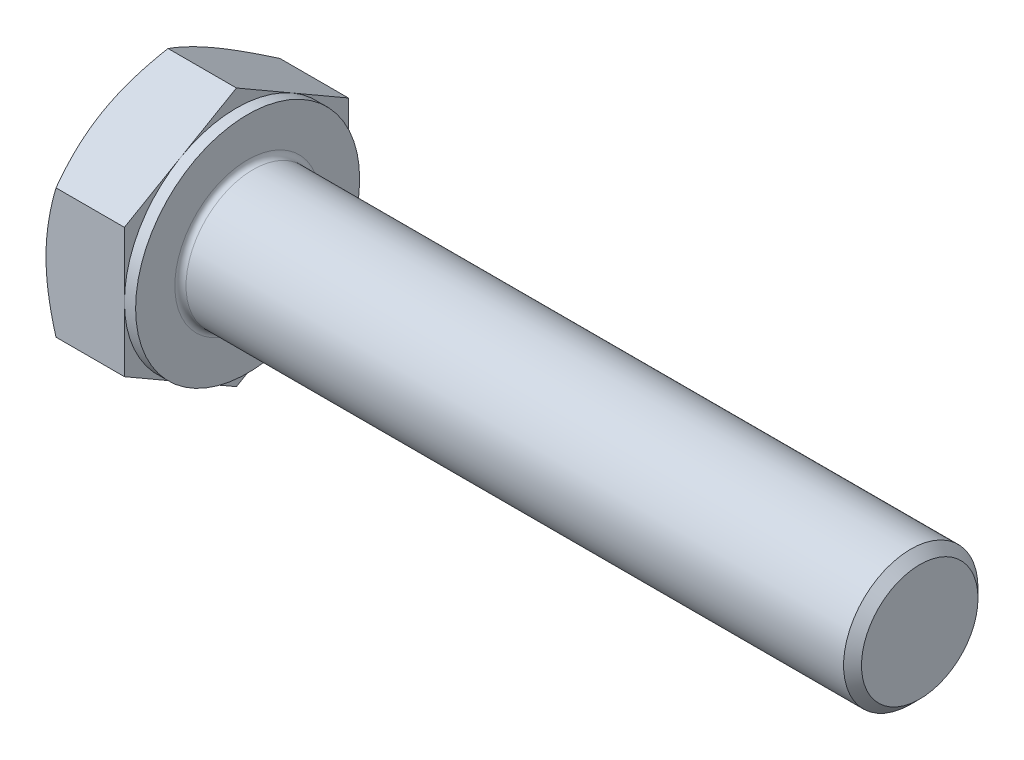
ISO-10303-21;
HEADER;
FILE_DESCRIPTION(('STEP AP214'),'2;1');
FILE_NAME('part.step','',(''),(''),'','','');
FILE_SCHEMA(('AUTOMOTIVE_DESIGN { 1 0 10303 214 1 1 1 1 }'));
ENDSEC;
DATA;
#1=APPLICATION_CONTEXT('core data for automotive mechanical design processes');
#2=APPLICATION_PROTOCOL_DEFINITION('international standard','automotive_design',2000,#1);
#3=PRODUCT_CONTEXT('',#1,'mechanical');
#4=PRODUCT('Part','Part','',(#3));
#5=PRODUCT_RELATED_PRODUCT_CATEGORY('part','',(#4));
#6=PRODUCT_DEFINITION_FORMATION('','',#4);
#7=PRODUCT_DEFINITION_CONTEXT('part definition',#1,'design');
#8=PRODUCT_DEFINITION('design','',#6,#7);
#9=PRODUCT_DEFINITION_SHAPE('','',#8);
#10=(LENGTH_UNIT() NAMED_UNIT(*) SI_UNIT(.MILLI.,.METRE.));
#11=(NAMED_UNIT(*) PLANE_ANGLE_UNIT() SI_UNIT($,.RADIAN.));
#12=(NAMED_UNIT(*) SI_UNIT($,.STERADIAN.) SOLID_ANGLE_UNIT());
#13=UNCERTAINTY_MEASURE_WITH_UNIT(LENGTH_MEASURE(1.E-05),#10,'distance_accuracy_value','');
#14=(GEOMETRIC_REPRESENTATION_CONTEXT(3) GLOBAL_UNCERTAINTY_ASSIGNED_CONTEXT((#13)) GLOBAL_UNIT_ASSIGNED_CONTEXT((#10,
#11,#12)) REPRESENTATION_CONTEXT('',''));
#15=CARTESIAN_POINT('',(0.,0.,0.));
#16=DIRECTION('',(0.,0.,1.));
#17=DIRECTION('',(1.,0.,0.));
#18=AXIS2_PLACEMENT_3D('',#15,#16,#17);
#19=CARTESIAN_POINT('',(0.,0.,0.));
#20=DIRECTION('',(-1.,0.,0.));
#21=DIRECTION('',(0.,0.,1.));
#22=AXIS2_PLACEMENT_3D('',#19,#20,#21);
#23=CYLINDRICAL_SURFACE('',#22,3.);
#24=CARTESIAN_POINT('',(33.6,0.,0.));
#25=DIRECTION('',(1.,0.,0.));
#26=DIRECTION('',(0.,0.,-1.));
#27=AXIS2_PLACEMENT_3D('',#24,#25,#26);
#28=CIRCLE('',#27,3.);
#29=CARTESIAN_POINT('',(33.6,0.,-3.));
#30=VERTEX_POINT('',#29);
#31=EDGE_CURVE('E13',#30,#30,#28,.F.);
#32=ORIENTED_EDGE('',*,*,#31,.T.);
#33=EDGE_LOOP('',(#32));
#34=FACE_BOUND('',#33,.T.);
#35=CARTESIAN_POINT('',(4.25,0.,0.));
#36=DIRECTION('',(1.,0.,0.));
#37=DIRECTION('',(0.,0.,-1.));
#38=AXIS2_PLACEMENT_3D('',#35,#36,#37);
#39=CIRCLE('',#38,3.);
#40=CARTESIAN_POINT('',(4.25,0.,-3.));
#41=VERTEX_POINT('',#40);
#42=EDGE_CURVE('E279',#41,#41,#39,.T.);
#43=ORIENTED_EDGE('',*,*,#42,.T.);
#44=EDGE_LOOP('',(#43));
#45=FACE_BOUND('',#44,.T.);
#46=ADVANCED_FACE('F42',(#34,#45),#23,.T.);
#47=CARTESIAN_POINT('',(4.,5.77350269189626,0.));
#48=DIRECTION('',(1.,0.,0.));
#49=DIRECTION('',(0.,0.,-1.));
#50=AXIS2_PLACEMENT_3D('',#47,#48,#49);
#51=PLANE('',#50);
#52=CARTESIAN_POINT('',(4.,0.,0.));
#53=DIRECTION('',(1.,0.,0.));
#54=DIRECTION('',(0.,0.,-1.));
#55=AXIS2_PLACEMENT_3D('',#52,#53,#54);
#56=CIRCLE('',#55,3.25);
#57=CARTESIAN_POINT('',(4.,0.,-3.25));
#58=VERTEX_POINT('',#57);
#59=EDGE_CURVE('E280',#58,#58,#56,.F.);
#60=ORIENTED_EDGE('',*,*,#59,.T.);
#61=EDGE_LOOP('',(#60));
#62=FACE_BOUND('',#61,.T.);
#63=CARTESIAN_POINT('',(4.,0.,0.));
#64=DIRECTION('',(1.,0.,0.));
#65=DIRECTION('',(0.,0.,-1.));
#66=AXIS2_PLACEMENT_3D('',#63,#64,#65);
#67=CIRCLE('',#66,5.);
#68=CARTESIAN_POINT('',(4.,0.,-5.));
#69=VERTEX_POINT('',#68);
#70=EDGE_CURVE('E289',#69,#69,#67,.T.);
#71=ORIENTED_EDGE('',*,*,#70,.T.);
#72=EDGE_LOOP('',(#71));
#73=FACE_BOUND('',#72,.T.);
#74=ADVANCED_FACE('F269',(#62,#73),#51,.T.);
#75=CARTESIAN_POINT('',(3.5,5.,0.));
#76=DIRECTION('',(1.,0.,0.));
#77=DIRECTION('',(0.,0.,-1.));
#78=AXIS2_PLACEMENT_3D('',#75,#76,#77);
#79=PLANE('',#78);
#80=DIRECTION('',(0.,0.5,0.866025403784438));
#81=VECTOR('',#80,1.);
#82=CARTESIAN_POINT('',(3.5,2.88675134594812,-5.));
#83=LINE('',#82,#81);
#84=CARTESIAN_POINT('',(3.5,2.88675134594812,-5.));
#85=VERTEX_POINT('',#84);
#86=CARTESIAN_POINT('',(3.5,4.33012701892219,-2.5));
#87=VERTEX_POINT('',#86);
#88=EDGE_CURVE('E175',#85,#87,#83,.T.);
#89=ORIENTED_EDGE('',*,*,#88,.T.);
#90=CARTESIAN_POINT('',(3.5,0.,0.));
#91=DIRECTION('',(-1.,0.,0.));
#92=DIRECTION('',(0.,0.,1.));
#93=AXIS2_PLACEMENT_3D('',#90,#91,#92);
#94=CIRCLE('',#93,5.);
#95=CARTESIAN_POINT('',(3.5,0.,-5.));
#96=VERTEX_POINT('',#95);
#97=EDGE_CURVE('E58',#87,#96,#94,.T.);
#98=ORIENTED_EDGE('',*,*,#97,.T.);
#99=DIRECTION('',(0.,1.,0.));
#100=VECTOR('',#99,1.);
#101=CARTESIAN_POINT('',(3.5,2.88675134594812,-5.));
#102=LINE('',#101,#100);
#103=EDGE_CURVE('E287',#96,#85,#102,.T.);
#104=ORIENTED_EDGE('',*,*,#103,.T.);
#105=EDGE_LOOP('',(#89,#98,#104));
#106=FACE_BOUND('',#105,.T.);
#107=ADVANCED_FACE('F274',(#106),#79,.T.);
#108=CARTESIAN_POINT('',(3.5,5.77350269189626,0.));
#109=VERTEX_POINT('',#108);
#110=EDGE_CURVE('E173',#87,#109,#83,.T.);
#111=ORIENTED_EDGE('',*,*,#110,.T.);
#112=DIRECTION('',(0.,-0.5,0.866025403784438));
#113=VECTOR('',#112,1.);
#114=CARTESIAN_POINT('',(3.5,5.77350269189626,0.));
#115=LINE('',#114,#113);
#116=CARTESIAN_POINT('',(3.5,4.33012701892219,2.5));
#117=VERTEX_POINT('',#116);
#118=EDGE_CURVE('E172',#109,#117,#115,.T.);
#119=ORIENTED_EDGE('',*,*,#118,.T.);
#120=EDGE_CURVE('E161',#117,#87,#94,.T.);
#121=ORIENTED_EDGE('',*,*,#120,.T.);
#122=EDGE_LOOP('',(#111,#119,#121));
#123=FACE_BOUND('',#122,.T.);
#124=ADVANCED_FACE('F361',(#123),#79,.T.);
#125=CARTESIAN_POINT('',(3.5,2.88675134594812,5.));
#126=VERTEX_POINT('',#125);
#127=EDGE_CURVE('E140',#117,#126,#115,.T.);
#128=ORIENTED_EDGE('',*,*,#127,.T.);
#129=DIRECTION('',(0.,-1.,0.));
#130=VECTOR('',#129,1.);
#131=CARTESIAN_POINT('',(3.5,2.88675134594812,5.));
#132=LINE('',#131,#130);
#133=CARTESIAN_POINT('',(3.5,0.,5.));
#134=VERTEX_POINT('',#133);
#135=EDGE_CURVE('E134',#126,#134,#132,.T.);
#136=ORIENTED_EDGE('',*,*,#135,.T.);
#137=EDGE_CURVE('E138',#134,#117,#94,.T.);
#138=ORIENTED_EDGE('',*,*,#137,.T.);
#139=EDGE_LOOP('',(#128,#136,#138));
#140=FACE_BOUND('',#139,.T.);
#141=ADVANCED_FACE('F136',(#140),#79,.T.);
#142=CARTESIAN_POINT('',(3.5,-2.88675134594812,5.));
#143=VERTEX_POINT('',#142);
#144=EDGE_CURVE('E144',#134,#143,#132,.T.);
#145=ORIENTED_EDGE('',*,*,#144,.T.);
#146=DIRECTION('',(0.,-0.5,-0.866025403784438));
#147=VECTOR('',#146,1.);
#148=CARTESIAN_POINT('',(3.5,-5.77350269189626,0.));
#149=LINE('',#148,#147);
#150=CARTESIAN_POINT('',(3.5,-4.33012701892219,2.5));
#151=VERTEX_POINT('',#150);
#152=EDGE_CURVE('E151',#143,#151,#149,.T.);
#153=ORIENTED_EDGE('',*,*,#152,.T.);
#154=EDGE_CURVE('E148',#151,#134,#94,.T.);
#155=ORIENTED_EDGE('',*,*,#154,.T.);
#156=EDGE_LOOP('',(#145,#153,#155));
#157=FACE_BOUND('',#156,.T.);
#158=ADVANCED_FACE('F149',(#157),#79,.T.);
#159=CARTESIAN_POINT('',(3.5,-5.77350269189626,0.));
#160=VERTEX_POINT('',#159);
#161=EDGE_CURVE('E167',#151,#160,#149,.T.);
#162=ORIENTED_EDGE('',*,*,#161,.T.);
#163=DIRECTION('',(0.,0.5,-0.866025403784439));
#164=VECTOR('',#163,1.);
#165=CARTESIAN_POINT('',(3.5,-2.88675134594813,-5.));
#166=LINE('',#165,#164);
#167=CARTESIAN_POINT('',(3.5,-4.3301270189222,-2.5));
#168=VERTEX_POINT('',#167);
#169=EDGE_CURVE('E353',#160,#168,#166,.T.);
#170=ORIENTED_EDGE('',*,*,#169,.T.);
#171=EDGE_CURVE('E155',#168,#151,#94,.T.);
#172=ORIENTED_EDGE('',*,*,#171,.T.);
#173=EDGE_LOOP('',(#162,#170,#172));
#174=FACE_BOUND('',#173,.T.);
#175=ADVANCED_FACE('F375',(#174),#79,.T.);
#176=CARTESIAN_POINT('',(3.5,-2.88675134594813,-5.));
#177=VERTEX_POINT('',#176);
#178=EDGE_CURVE('E162',#168,#177,#166,.T.);
#179=ORIENTED_EDGE('',*,*,#178,.T.);
#180=EDGE_CURVE('E284',#177,#96,#102,.T.);
#181=ORIENTED_EDGE('',*,*,#180,.T.);
#182=EDGE_CURVE('E359',#96,#168,#94,.T.);
#183=ORIENTED_EDGE('',*,*,#182,.T.);
#184=EDGE_LOOP('',(#179,#181,#183));
#185=FACE_BOUND('',#184,.T.);
#186=ADVANCED_FACE('F357',(#185),#79,.T.);
#187=CARTESIAN_POINT('',(0.,0.,0.));
#188=DIRECTION('',(-1.,0.,0.));
#189=DIRECTION('',(0.,0.,1.));
#190=AXIS2_PLACEMENT_3D('',#187,#188,#189);
#191=CYLINDRICAL_SURFACE('',#190,5.);
#192=ORIENTED_EDGE('',*,*,#97,.F.);
#193=ORIENTED_EDGE('',*,*,#120,.F.);
#194=ORIENTED_EDGE('',*,*,#137,.F.);
#195=ORIENTED_EDGE('',*,*,#154,.F.);
#196=ORIENTED_EDGE('',*,*,#171,.F.);
#197=ORIENTED_EDGE('',*,*,#182,.F.);
#198=EDGE_LOOP('',(#192,#193,#194,#195,#196,#197));
#199=FACE_BOUND('',#198,.T.);
#200=ORIENTED_EDGE('',*,*,#70,.F.);
#201=EDGE_LOOP('',(#200));
#202=FACE_BOUND('',#201,.T.);
#203=ADVANCED_FACE('F158',(#199,#202),#191,.T.);
#204=CARTESIAN_POINT('',(0.,5.77350269189626,0.));
#205=DIRECTION('',(1.,0.,0.));
#206=DIRECTION('',(0.,0.,-1.));
#207=AXIS2_PLACEMENT_3D('',#204,#205,#206);
#208=PLANE('',#207);
#209=CARTESIAN_POINT('',(0.,0.,0.));
#210=DIRECTION('',(1.,0.,0.));
#211=DIRECTION('',(0.,0.,-1.));
#212=AXIS2_PLACEMENT_3D('',#209,#210,#211);
#213=CIRCLE('',#212,5.);
#214=CARTESIAN_POINT('',(0.,0.,-5.));
#215=VERTEX_POINT('',#214);
#216=CARTESIAN_POINT('',(0.,4.33012701892219,-2.5));
#217=VERTEX_POINT('',#216);
#218=EDGE_CURVE('E292',#215,#217,#213,.T.);
#219=ORIENTED_EDGE('',*,*,#218,.F.);
#220=CARTESIAN_POINT('',(0.,-4.3301270189222,-2.5));
#221=VERTEX_POINT('',#220);
#222=EDGE_CURVE('E293',#221,#215,#213,.T.);
#223=ORIENTED_EDGE('',*,*,#222,.F.);
#224=CARTESIAN_POINT('',(0.,-4.33012701892219,2.5));
#225=VERTEX_POINT('',#224);
#226=EDGE_CURVE('E296',#225,#221,#213,.T.);
#227=ORIENTED_EDGE('',*,*,#226,.F.);
#228=CARTESIAN_POINT('',(0.,0.,5.));
#229=VERTEX_POINT('',#228);
#230=EDGE_CURVE('E327',#229,#225,#213,.T.);
#231=ORIENTED_EDGE('',*,*,#230,.F.);
#232=CARTESIAN_POINT('',(0.,0.,0.));
#233=DIRECTION('',(-1.,0.,0.));
#234=DIRECTION('',(0.,0.,1.));
#235=AXIS2_PLACEMENT_3D('',#232,#233,#234);
#236=CIRCLE('',#235,5.);
#237=CARTESIAN_POINT('',(0.,4.33012701892219,2.5));
#238=VERTEX_POINT('',#237);
#239=EDGE_CURVE('E176',#229,#238,#236,.T.);
#240=ORIENTED_EDGE('',*,*,#239,.T.);
#241=EDGE_CURVE('E324',#217,#238,#213,.T.);
#242=ORIENTED_EDGE('',*,*,#241,.F.);
#243=EDGE_LOOP('',(#219,#223,#227,#231,#240,#242));
#244=FACE_BOUND('',#243,.T.);
#245=ADVANCED_FACE('F207',(#244),#208,.F.);
#246=CARTESIAN_POINT('',(0.,0.,0.));
#247=DIRECTION('',(1.,0.,0.));
#248=DIRECTION('',(0.,0.,-1.));
#249=AXIS2_PLACEMENT_3D('',#246,#247,#248);
#250=CONICAL_SURFACE('',#249,5.,1.0471975511966);
#251=CARTESIAN_POINT('',(0.446648656051827,2.88663587589428,5.0002));
#252=CARTESIAN_POINT('',(0.373386567637635,3.01349970319368,4.78046540547482));
#253=CARTESIAN_POINT('',(0.306751321918093,3.14144859993849,4.55885141554042));
#254=CARTESIAN_POINT('',(0.190438991010812,3.39956193532121,4.11178600454649));
#255=CARTESIAN_POINT('',(0.14080304991579,3.52973095989718,3.88632664040923));
#256=CARTESIAN_POINT('',(0.0635510254186983,3.78847564779798,3.43816769477649));
#257=CARTESIAN_POINT('',(0.0354203782834898,3.91701101576052,3.21553790689581));
#258=CARTESIAN_POINT('',(0.010194921953685,4.11026620624322,2.88081009815336));
#259=CARTESIAN_POINT('',(0.00461345976948444,4.17472868879311,2.76915780319494));
#260=CARTESIAN_POINT('',(-0.000797783248529604,4.30371322717528,2.5457500293262));
#261=CARTESIAN_POINT('',(-0.000627741741796743,4.36823528110589,2.43399455370969));
#262=CARTESIAN_POINT('',(0.00775363179203634,4.54500768479194,2.12781576914936));
#263=CARTESIAN_POINT('',(0.0218297718972521,4.65719946015293,1.93349391403279));
#264=CARTESIAN_POINT('',(0.0664652571094323,4.88083840557981,1.54613989800229));
#265=CARTESIAN_POINT('',(0.0970398601475096,4.9922847895602,1.35310909862843));
#266=CARTESIAN_POINT('',(0.173468493621166,5.21637431361295,0.964974657525145));
#267=CARTESIAN_POINT('',(0.219646378878682,5.32898917185759,0.769920001358263));
#268=CARTESIAN_POINT('',(0.324451794491937,5.55253939626498,0.38271965464123));
#269=CARTESIAN_POINT('',(0.383054703437377,5.66347762579592,0.190569004591912));
#270=CARTESIAN_POINT('',(0.446648656051831,5.7736181619501,-0.000200000000000734));
#271=B_SPLINE_CURVE_WITH_KNOTS('',3,(#251,#252,#253,#254,#255,#256,#257,#258,#259,#260,#261,
#262,#263,#264,#265,#266,#267,#268,#269,#270),.UNSPECIFIED.,.F.,.F.,(4,2,2,2,2,2,2,2,2,4),(0.,
0.792555841363091,1.58701660053333,2.36181537487281,2.74884076077325,3.13585419177295,
3.80962362599679,4.4840172390119,5.17336882348929,5.86136694793726),.UNSPECIFIED.);
#272=CARTESIAN_POINT('',(0.446581987385204,5.77350269189626,0.));
#273=VERTEX_POINT('',#272);
#274=EDGE_CURVE('E227',#238,#273,#271,.T.);
#275=ORIENTED_EDGE('',*,*,#274,.T.);
#276=CARTESIAN_POINT('',(0.446648656051831,5.7736181619501,0.000199999999999985));
#277=CARTESIAN_POINT('',(0.373386567637636,5.64675433465071,-0.219534594525184));
#278=CARTESIAN_POINT('',(0.306751321918092,5.5188054379059,-0.441148584459579));
#279=CARTESIAN_POINT('',(0.190438991010811,5.26069210252318,-0.888213995453511));
#280=CARTESIAN_POINT('',(0.140803049915789,5.13052307794721,-1.11367335959077));
#281=CARTESIAN_POINT('',(0.0635510254186974,4.87177839004641,-1.56183230522351));
#282=CARTESIAN_POINT('',(0.0354203782834886,4.74324302208387,-1.78446209310419));
#283=CARTESIAN_POINT('',(0.0101949219536831,4.54998783160116,-2.11918990184664));
#284=CARTESIAN_POINT('',(0.00461345976948224,4.48552534905128,-2.23084219680506));
#285=CARTESIAN_POINT('',(-0.000797783248531142,4.35654081066911,-2.4542499706738));
#286=CARTESIAN_POINT('',(-0.00062774174179731,4.2920187567385,-2.56600544629031));
#287=CARTESIAN_POINT('',(0.00775363179203666,4.11524635305244,-2.87218423085064));
#288=CARTESIAN_POINT('',(0.0218297718972511,4.00305457769146,-3.06650608596721));
#289=CARTESIAN_POINT('',(0.0664652571094299,3.77941563226457,-3.45386010199771));
#290=CARTESIAN_POINT('',(0.0970398601475073,3.66796924828418,-3.64689090137157));
#291=CARTESIAN_POINT('',(0.173468493621163,3.44387972423143,-4.03502534247485));
#292=CARTESIAN_POINT('',(0.21964637887868,3.3312648659868,-4.23007999864174));
#293=CARTESIAN_POINT('',(0.324451794491934,3.1077146415794,-4.61728034535877));
#294=CARTESIAN_POINT('',(0.383054703437374,2.99677641204846,-4.80943099540809));
#295=CARTESIAN_POINT('',(0.446648656051827,2.88663587589428,-5.0002));
#296=B_SPLINE_CURVE_WITH_KNOTS('',3,(#276,#277,#278,#279,#280,#281,#282,#283,#284,#285,#286,
#287,#288,#289,#290,#291,#292,#293,#294,#295),.UNSPECIFIED.,.F.,.F.,(4,2,2,2,2,2,2,2,2,4),(0.,
0.792555841363092,1.58701660053334,2.36181537487281,2.74884076077326,3.13585419177295,
3.8096236259968,4.4840172390119,5.17336882348929,5.86136694793726),.UNSPECIFIED.);
#297=EDGE_CURVE('E66',#273,#217,#296,.T.);
#298=ORIENTED_EDGE('',*,*,#297,.T.);
#299=ORIENTED_EDGE('',*,*,#241,.T.);
#300=EDGE_LOOP('',(#275,#298,#299));
#301=FACE_BOUND('',#300,.T.);
#302=ADVANCED_FACE('F325',(#301),#250,.T.);
#303=CARTESIAN_POINT('',(2.47533544689295,-7.82661640313889,5.));
#304=CARTESIAN_POINT('',(2.36879683507773,-7.60758613024921,5.));
#305=CARTESIAN_POINT('',(2.26325911833056,-7.3880607136441,5.));
#306=CARTESIAN_POINT('',(2.05474707865951,-6.94775649535433,5.));
#307=CARTESIAN_POINT('',(1.95177314617003,-6.72697750897687,5.));
#308=CARTESIAN_POINT('',(1.74844778545275,-6.28280027125596,5.));
#309=CARTESIAN_POINT('',(1.64811306490869,-6.05939434592712,5.));
#310=CARTESIAN_POINT('',(1.45145486004312,-5.6108304383292,5.));
#311=CARTESIAN_POINT('',(1.35513119080617,-5.38567253739804,5.));
#312=CARTESIAN_POINT('',(1.16445037605961,-4.92576614780202,5.));
#313=CARTESIAN_POINT('',(1.07026351405996,-4.69094667859484,5.));
#314=CARTESIAN_POINT('',(0.888844387350839,-4.21858752735362,5.));
#315=CARTESIAN_POINT('',(0.801612892640661,-3.98104754746316,5.));
#316=CARTESIAN_POINT('',(0.63634107188324,-3.50329086404363,5.));
#317=CARTESIAN_POINT('',(0.558282765149711,-3.26308044250486,5.));
#318=CARTESIAN_POINT('',(0.413813856737665,-2.77921467819531,5.));
#319=CARTESIAN_POINT('',(0.347399663631973,-2.53556042275999,5.));
#320=CARTESIAN_POINT('',(0.22970745053505,-2.04600448312503,5.));
#321=CARTESIAN_POINT('',(0.178346573442478,-1.80012308686183,5.));
#322=CARTESIAN_POINT('',(0.0936230804935153,-1.30522837494365,5.));
#323=CARTESIAN_POINT('',(0.0602585789244922,-1.05621539022477,5.));
#324=CARTESIAN_POINT('',(0.0146229933804839,-0.559584253783065,5.));
#325=CARTESIAN_POINT('',(0.00207498506584042,-0.311992192967673,5.));
#326=CARTESIAN_POINT('',(-0.00159747165030556,0.18337558405674,5.));
#327=CARTESIAN_POINT('',(0.00727849448086234,0.431151303726643,5.));
#328=CARTESIAN_POINT('',(0.0397265053205846,0.84962286075823,5.));
#329=CARTESIAN_POINT('',(0.0579847912618802,1.02075746544157,5.));
#330=CARTESIAN_POINT('',(0.103624049996723,1.3618139875752,5.));
#331=CARTESIAN_POINT('',(0.131006199082925,1.53173574577271,5.));
#332=CARTESIAN_POINT('',(0.225403333816324,2.03942834541587,5.));
#333=CARTESIAN_POINT('',(0.304653621104038,2.37495177168563,5.));
#334=CARTESIAN_POINT('',(0.442611792168642,2.87686006020152,5.));
#335=CARTESIAN_POINT('',(0.49245303592812,3.04583048582565,5.));
#336=CARTESIAN_POINT('',(0.597441969480144,3.38213061038659,5.));
#337=CARTESIAN_POINT('',(0.652589698776809,3.54946029709869,5.));
#338=CARTESIAN_POINT('',(0.767295730006401,3.88253122341817,5.));
#339=CARTESIAN_POINT('',(0.82685271313782,4.04827292137365,5.));
#340=CARTESIAN_POINT('',(0.949663499110055,4.37837269604183,5.));
#341=CARTESIAN_POINT('',(1.01291722636637,4.54273080096526,5.));
#342=CARTESIAN_POINT('',(1.18384085306905,4.9746759403977,5.));
#343=CARTESIAN_POINT('',(1.29410564783453,5.24123504256648,5.));
#344=CARTESIAN_POINT('',(1.52085041203993,5.77170603526334,5.));
#345=CARTESIAN_POINT('',(1.63733099805397,6.03561766007928,5.));
#346=CARTESIAN_POINT('',(1.87507624393349,6.56138078778337,5.));
#347=CARTESIAN_POINT('',(1.99634255328239,6.82323154239329,5.));
#348=CARTESIAN_POINT('',(2.24254703861693,7.34518395602015,5.));
#349=CARTESIAN_POINT('',(2.36748508200603,7.60528567778374,5.));
#350=CARTESIAN_POINT('',(2.62044102887899,8.12446478659922,5.));
#351=CARTESIAN_POINT('',(2.74846325062127,8.38354006552432,5.));
#352=CARTESIAN_POINT('',(3.0068266896755,8.9005329112754,5.));
#353=CARTESIAN_POINT('',(3.13716793074433,9.15845046620729,5.));
#354=CARTESIAN_POINT('',(3.53092424591318,9.93067662274979,5.));
#355=CARTESIAN_POINT('',(3.79712405172276,10.4435647238032,5.));
#356=CARTESIAN_POINT('',(4.30724046881172,11.4147548711532,5.));
#357=CARTESIAN_POINT('',(4.55067498762246,11.873311348306,5.));
#358=CARTESIAN_POINT('',(5.040529157853,12.7888590468283,5.));
#359=CARTESIAN_POINT('',(5.28694897482745,13.2458501795696,5.));
#360=CARTESIAN_POINT('',(5.78122505346442,14.1571829390173,5.));
#361=CARTESIAN_POINT('',(6.02907430461247,14.6115283739736,5.));
#362=CARTESIAN_POINT('',(6.52648185519852,15.5192398746589,5.));
#363=CARTESIAN_POINT('',(6.77604002809908,15.9726060096992,5.));
#364=CARTESIAN_POINT('',(7.02622264559118,16.4256251044156,5.));
#365=B_SPLINE_CURVE_WITH_KNOTS('',3,(#303,#304,#305,#306,#307,#308,#309,#310,#311,#312,#313,
#314,#315,#316,#317,#318,#319,#320,#321,#322,#323,#324,#325,#326,#327,#328,#329,#330,#331,#332,
#333,#334,#335,#336,#337,#338,#339,#340,#341,#342,#343,#344,#345,#346,#347,#348,#349,#350,#351,
#352,#353,#354,#355,#356,#357,#358,#359,#360,#361,#362,#363,#364),.UNSPECIFIED.,.F.,.F.,(4,2,2,
2,2,2,2,2,2,2,2,2,2,2,2,2,2,2,2,2,2,2,2,2,2,2,2,2,2,2,4),(0.,0.730708682143098,1.4615279703375,
2.19620403652929,2.930846195478,3.68977491658213,4.44878753915767,5.20628666210827,
5.96355173484849,6.71656679485871,7.46950293642267,8.21233991237299,8.95519126159773,
9.47125991232469,9.98739512288342,11.0201893937443,11.5486465414698,12.0771076235976,
12.6054112774226,13.1337041332035,13.9989833719716,14.8643486020619,15.7300147459346,
16.5956496665091,17.4625765068272,18.3295122333794,20.0630293163822,21.6205191219182,
23.1780956996636,24.7307447704824,26.2832800921358),.UNSPECIFIED.);
#366=CARTESIAN_POINT('',(0.4465819873852,2.88675134594812,5.));
#367=VERTEX_POINT('',#366);
#368=EDGE_CURVE('E242',#229,#367,#365,.T.);
#369=ORIENTED_EDGE('',*,*,#368,.T.);
#370=EDGE_CURVE('E241',#367,#238,#271,.T.);
#371=ORIENTED_EDGE('',*,*,#370,.T.);
#372=ORIENTED_EDGE('',*,*,#239,.F.);
#373=EDGE_LOOP('',(#369,#371,#372));
#374=FACE_BOUND('',#373,.T.);
#375=ADVANCED_FACE('F320',(#374),#250,.T.);
#376=CARTESIAN_POINT('',(0.446581987385199,-2.88675134594812,5.));
#377=VERTEX_POINT('',#376);
#378=EDGE_CURVE('E306',#377,#229,#365,.T.);
#379=ORIENTED_EDGE('',*,*,#378,.T.);
#380=ORIENTED_EDGE('',*,*,#230,.T.);
#381=CARTESIAN_POINT('',(0.446648656051832,-5.7736181619501,-0.000200000000000052));
#382=CARTESIAN_POINT('',(0.373386567637638,-5.64675433465071,0.219534594525184));
#383=CARTESIAN_POINT('',(0.306751321918094,-5.5188054379059,0.44114858445958));
#384=CARTESIAN_POINT('',(0.190438991010812,-5.26069210252318,0.888213995453513));
#385=CARTESIAN_POINT('',(0.14080304991579,-5.13052307794721,1.11367335959077));
#386=CARTESIAN_POINT('',(0.0635510254186989,-4.87177839004641,1.56183230522351));
#387=CARTESIAN_POINT('',(0.0354203782834902,-4.74324302208387,1.78446209310419));
#388=CARTESIAN_POINT('',(0.0101949219536849,-4.54998783160116,2.11918990184664));
#389=CARTESIAN_POINT('',(0.00461345976948422,-4.48552534905128,2.23084219680506));
#390=CARTESIAN_POINT('',(-0.000797783248529864,-4.35654081066911,2.4542499706738));
#391=CARTESIAN_POINT('',(-0.000627741741796916,-4.2920187567385,2.56600544629031));
#392=CARTESIAN_POINT('',(0.00775363179203633,-4.11524635305244,2.87218423085064));
#393=CARTESIAN_POINT('',(0.0218297718972522,-4.00305457769146,3.06650608596721));
#394=CARTESIAN_POINT('',(0.0664652571094321,-3.77941563226457,3.45386010199771));
#395=CARTESIAN_POINT('',(0.0970398601475091,-3.66796924828418,3.64689090137157));
#396=CARTESIAN_POINT('',(0.173468493621165,-3.44387972423144,4.03502534247485));
#397=CARTESIAN_POINT('',(0.219646378878682,-3.3312648659868,4.23007999864174));
#398=CARTESIAN_POINT('',(0.324451794491935,-3.1077146415794,4.61728034535877));
#399=CARTESIAN_POINT('',(0.383054703437374,-2.99677641204847,4.80943099540809));
#400=CARTESIAN_POINT('',(0.446648656051826,-2.88663587589428,5.0002));
#401=B_SPLINE_CURVE_WITH_KNOTS('',3,(#381,#382,#383,#384,#385,#386,#387,#388,#389,#390,#391,
#392,#393,#394,#395,#396,#397,#398,#399,#400),.UNSPECIFIED.,.F.,.F.,(4,2,2,2,2,2,2,2,2,4),(0.,
0.792555841363091,1.58701660053334,2.36181537487281,2.74884076077326,3.13585419177295,
3.8096236259968,4.4840172390119,5.17336882348929,5.86136694793726),.UNSPECIFIED.);
#402=EDGE_CURVE('E229',#225,#377,#401,.T.);
#403=ORIENTED_EDGE('',*,*,#402,.T.);
#404=EDGE_LOOP('',(#379,#380,#403));
#405=FACE_BOUND('',#404,.T.);
#406=ADVANCED_FACE('F196',(#405),#250,.T.);
#407=CARTESIAN_POINT('',(0.446581987385205,-5.77350269189626,0.));
#408=VERTEX_POINT('',#407);
#409=EDGE_CURVE('E221',#408,#225,#401,.T.);
#410=ORIENTED_EDGE('',*,*,#409,.T.);
#411=ORIENTED_EDGE('',*,*,#226,.T.);
#412=CARTESIAN_POINT('',(0.44664865605183,-2.88663587589429,-5.0002));
#413=CARTESIAN_POINT('',(0.373386567637638,-3.01349970319368,-4.78046540547481));
#414=CARTESIAN_POINT('',(0.306751321918095,-3.1414485999385,-4.55885141554042));
#415=CARTESIAN_POINT('',(0.190438991010814,-3.39956193532121,-4.11178600454649));
#416=CARTESIAN_POINT('',(0.140803049915792,-3.52973095989718,-3.88632664040923));
#417=CARTESIAN_POINT('',(0.0635510254187006,-3.78847564779798,-3.43816769477649));
#418=CARTESIAN_POINT('',(0.0354203782834919,-3.91701101576052,-3.21553790689581));
#419=CARTESIAN_POINT('',(0.0101949219536869,-4.11026620624323,-2.88081009815336));
#420=CARTESIAN_POINT('',(0.00461345976948628,-4.17472868879311,-2.76915780319494));
#421=CARTESIAN_POINT('',(-0.000797783248526919,-4.30371322717528,-2.5457500293262));
#422=CARTESIAN_POINT('',(-0.000627741741793152,-4.36823528110589,-2.43399455370968));
#423=CARTESIAN_POINT('',(0.00775363179204073,-4.54500768479195,-2.12781576914936));
#424=CARTESIAN_POINT('',(0.0218297718972551,-4.65719946015293,-1.93349391403278));
#425=CARTESIAN_POINT('',(0.0664652571094345,-4.88083840557982,-1.54613989800229));
#426=CARTESIAN_POINT('',(0.0970398601475124,-4.99228478956021,-1.35310909862843));
#427=CARTESIAN_POINT('',(0.173468493621169,-5.21637431361295,-0.964974657525144));
#428=CARTESIAN_POINT('',(0.219646378878685,-5.32898917185759,-0.769920001358263));
#429=CARTESIAN_POINT('',(0.324451794491938,-5.55253939626499,-0.382719654641231));
#430=CARTESIAN_POINT('',(0.383054703437378,-5.66347762579592,-0.190569004591913));
#431=CARTESIAN_POINT('',(0.446648656051833,-5.7736181619501,0.000200000000000639));
#432=B_SPLINE_CURVE_WITH_KNOTS('',3,(#412,#413,#414,#415,#416,#417,#418,#419,#420,#421,#422,
#423,#424,#425,#426,#427,#428,#429,#430,#431),.UNSPECIFIED.,.F.,.F.,(4,2,2,2,2,2,2,2,2,4),(0.,
0.792555841363092,1.58701660053334,2.36181537487281,2.74884076077326,3.13585419177295,
3.8096236259968,4.48401723901189,5.17336882348929,5.86136694793725),.UNSPECIFIED.);
#433=EDGE_CURVE('E228',#221,#408,#432,.T.);
#434=ORIENTED_EDGE('',*,*,#433,.T.);
#435=EDGE_LOOP('',(#410,#411,#434));
#436=FACE_BOUND('',#435,.T.);
#437=ADVANCED_FACE('F350',(#436),#250,.T.);
#438=CARTESIAN_POINT('',(0.4465819873852,2.88675134594812,-5.));
#439=VERTEX_POINT('',#438);
#440=EDGE_CURVE('E230',#217,#439,#296,.T.);
#441=ORIENTED_EDGE('',*,*,#440,.T.);
#442=CARTESIAN_POINT('',(2.47533544689296,-7.82661640313891,-5.));
#443=CARTESIAN_POINT('',(2.36879683507774,-7.60758613024923,-5.));
#444=CARTESIAN_POINT('',(2.26325911833057,-7.38806071364411,-5.));
#445=CARTESIAN_POINT('',(2.05474707865952,-6.94775649535434,-5.));
#446=CARTESIAN_POINT('',(1.95177314617004,-6.72697750897689,-5.));
#447=CARTESIAN_POINT('',(1.74844778545276,-6.28280027125598,-5.));
#448=CARTESIAN_POINT('',(1.6481130649087,-6.05939434592714,-5.));
#449=CARTESIAN_POINT('',(1.45145486004313,-5.61083043832921,-5.));
#450=CARTESIAN_POINT('',(1.35513119080618,-5.38567253739806,-5.));
#451=CARTESIAN_POINT('',(1.16445037605961,-4.92576614780204,-5.));
#452=CARTESIAN_POINT('',(1.07026351405996,-4.69094667859486,-5.));
#453=CARTESIAN_POINT('',(0.888844387350845,-4.21858752735363,-5.));
#454=CARTESIAN_POINT('',(0.801612892640667,-3.98104754746318,-5.));
#455=CARTESIAN_POINT('',(0.636341071883246,-3.50329086404364,-5.));
#456=CARTESIAN_POINT('',(0.558282765149716,-3.26308044250488,-5.));
#457=CARTESIAN_POINT('',(0.413813856737669,-2.77921467819532,-5.));
#458=CARTESIAN_POINT('',(0.347399663631978,-2.53556042276,-5.));
#459=CARTESIAN_POINT('',(0.229707450535054,-2.04600448312504,-5.));
#460=CARTESIAN_POINT('',(0.17834657344248,-1.80012308686184,-5.));
#461=CARTESIAN_POINT('',(0.0936230804935167,-1.30522837494366,-5.));
#462=CARTESIAN_POINT('',(0.0602585789244936,-1.05621539022478,-5.));
#463=CARTESIAN_POINT('',(0.0146229933804851,-0.559584253783074,-5.));
#464=CARTESIAN_POINT('',(0.00207498506584143,-0.311992192967681,-5.));
#465=CARTESIAN_POINT('',(-0.00159747165030505,0.183375584056732,-5.));
#466=CARTESIAN_POINT('',(0.0072784944808625,0.431151303726634,-5.));
#467=CARTESIAN_POINT('',(0.039726505320584,0.849622860758221,-5.));
#468=CARTESIAN_POINT('',(0.0579847912618791,1.02075746544156,-5.));
#469=CARTESIAN_POINT('',(0.103624049996722,1.36181398757519,-5.));
#470=CARTESIAN_POINT('',(0.131006199082924,1.5317357457727,-5.));
#471=CARTESIAN_POINT('',(0.225403333816322,2.03942834541586,-5.));
#472=CARTESIAN_POINT('',(0.304653621104036,2.37495177168562,-5.));
#473=CARTESIAN_POINT('',(0.442611792168639,2.87686006020151,-5.));
#474=CARTESIAN_POINT('',(0.492453035928116,3.04583048582564,-5.));
#475=CARTESIAN_POINT('',(0.59744196948014,3.38213061038658,-5.));
#476=CARTESIAN_POINT('',(0.652589698776805,3.54946029709868,-5.));
#477=CARTESIAN_POINT('',(0.767295730006398,3.88253122341816,-5.));
#478=CARTESIAN_POINT('',(0.826852713137817,4.04827292137364,-5.));
#479=CARTESIAN_POINT('',(0.949663499110051,4.37837269604182,-5.));
#480=CARTESIAN_POINT('',(1.01291722636637,4.54273080096525,-5.));
#481=CARTESIAN_POINT('',(1.18384085306904,4.97467594039768,-5.));
#482=CARTESIAN_POINT('',(1.29410564783453,5.24123504256647,-5.));
#483=CARTESIAN_POINT('',(1.52085041203993,5.77170603526333,-5.));
#484=CARTESIAN_POINT('',(1.63733099805397,6.03561766007927,-5.));
#485=CARTESIAN_POINT('',(1.87507624393349,6.56138078778336,-5.));
#486=CARTESIAN_POINT('',(1.99634255328238,6.82323154239327,-5.));
#487=CARTESIAN_POINT('',(2.24254703861693,7.34518395602014,-5.));
#488=CARTESIAN_POINT('',(2.36748508200602,7.60528567778372,-5.));
#489=CARTESIAN_POINT('',(2.62044102887898,8.1244647865992,-5.));
#490=CARTESIAN_POINT('',(2.74846325062126,8.38354006552431,-5.));
#491=CARTESIAN_POINT('',(3.00682668967549,8.90053291127539,-5.));
#492=CARTESIAN_POINT('',(3.13716793074433,9.15845046620727,-5.));
#493=CARTESIAN_POINT('',(3.53092424591317,9.93067662274978,-5.));
#494=CARTESIAN_POINT('',(3.79712405172276,10.4435647238032,-5.));
#495=CARTESIAN_POINT('',(4.30724046881171,11.4147548711531,-5.));
#496=CARTESIAN_POINT('',(4.55067498762246,11.873311348306,-5.));
#497=CARTESIAN_POINT('',(5.04052915785299,12.7888590468283,-5.));
#498=CARTESIAN_POINT('',(5.28694897482745,13.2458501795696,-5.));
#499=CARTESIAN_POINT('',(5.78122505346441,14.1571829390173,-5.));
#500=CARTESIAN_POINT('',(6.02907430461247,14.6115283739736,-5.));
#501=CARTESIAN_POINT('',(6.52648185519852,15.5192398746589,-5.));
#502=CARTESIAN_POINT('',(6.77604002809908,15.9726060096992,-5.));
#503=CARTESIAN_POINT('',(7.02622264559118,16.4256251044156,-5.));
#504=B_SPLINE_CURVE_WITH_KNOTS('',3,(#442,#443,#444,#445,#446,#447,#448,#449,#450,#451,#452,
#453,#454,#455,#456,#457,#458,#459,#460,#461,#462,#463,#464,#465,#466,#467,#468,#469,#470,#471,
#472,#473,#474,#475,#476,#477,#478,#479,#480,#481,#482,#483,#484,#485,#486,#487,#488,#489,#490,
#491,#492,#493,#494,#495,#496,#497,#498,#499,#500,#501,#502,#503),.UNSPECIFIED.,.F.,.F.,(4,2,2,
2,2,2,2,2,2,2,2,2,2,2,2,2,2,2,2,2,2,2,2,2,2,2,2,2,2,2,4),(0.,0.730708682143098,1.46152797033751,
2.19620403652928,2.930846195478,3.68977491658213,4.44878753915767,5.20628666210828,
5.9635517348485,6.71656679485872,7.46950293642268,8.212339912373,8.95519126159774,
9.4712599123247,9.98739512288343,11.0201893937443,11.5486465414698,12.0771076235976,
12.6054112774226,13.1337041332035,13.9989833719716,14.8643486020619,15.7300147459346,
16.5956496665091,17.4625765068272,18.3295122333794,20.0630293163822,21.6205191219182,
23.1780956996636,24.7307447704824,26.2832800921359),.UNSPECIFIED.);
#505=EDGE_CURVE('E188',#439,#215,#504,.F.);
#506=ORIENTED_EDGE('',*,*,#505,.T.);
#507=ORIENTED_EDGE('',*,*,#218,.T.);
#508=EDGE_LOOP('',(#441,#506,#507));
#509=FACE_BOUND('',#508,.T.);
#510=ADVANCED_FACE('F341',(#509),#250,.T.);
#511=CARTESIAN_POINT('',(0.446581987384948,-2.88675134594852,-5.));
#512=VERTEX_POINT('',#511);
#513=EDGE_CURVE('E189',#512,#221,#432,.T.);
#514=ORIENTED_EDGE('',*,*,#513,.T.);
#515=ORIENTED_EDGE('',*,*,#222,.T.);
#516=EDGE_CURVE('E179',#215,#512,#504,.F.);
#517=ORIENTED_EDGE('',*,*,#516,.T.);
#518=EDGE_LOOP('',(#514,#515,#517));
#519=FACE_BOUND('',#518,.T.);
#520=ADVANCED_FACE('F205',(#519),#250,.T.);
#521=CARTESIAN_POINT('',(4.,2.88675134594812,-5.));
#522=DIRECTION('',(0.,0.,1.));
#523=DIRECTION('',(1.,0.,0.));
#524=AXIS2_PLACEMENT_3D('',#521,#522,#523);
#525=PLANE('',#524);
#526=ORIENTED_EDGE('',*,*,#180,.F.);
#527=DIRECTION('',(-1.,0.,0.));
#528=VECTOR('',#527,1.);
#529=CARTESIAN_POINT('',(4.,-2.88675134594813,-5.));
#530=LINE('',#529,#528);
#531=EDGE_CURVE('E304',#177,#512,#530,.T.);
#532=ORIENTED_EDGE('',*,*,#531,.T.);
#533=ORIENTED_EDGE('',*,*,#516,.F.);
#534=ORIENTED_EDGE('',*,*,#505,.F.);
#535=DIRECTION('',(-1.,0.,0.));
#536=VECTOR('',#535,1.);
#537=CARTESIAN_POINT('',(4.,2.88675134594812,-5.));
#538=LINE('',#537,#536);
#539=EDGE_CURVE('E305',#85,#439,#538,.T.);
#540=ORIENTED_EDGE('',*,*,#539,.F.);
#541=ORIENTED_EDGE('',*,*,#103,.F.);
#542=EDGE_LOOP('',(#526,#532,#533,#534,#540,#541));
#543=FACE_BOUND('',#542,.T.);
#544=ADVANCED_FACE('F200',(#543),#525,.F.);
#545=CARTESIAN_POINT('',(4.,-2.88675134594813,-5.));
#546=DIRECTION('',(0.,0.866025403784439,0.5));
#547=DIRECTION('',(0.,-0.5,0.866025403784439));
#548=AXIS2_PLACEMENT_3D('',#545,#546,#547);
#549=PLANE('',#548);
#550=ORIENTED_EDGE('',*,*,#169,.F.);
#551=DIRECTION('',(-1.,0.,0.));
#552=VECTOR('',#551,1.);
#553=CARTESIAN_POINT('',(4.,-5.77350269189626,0.));
#554=LINE('',#553,#552);
#555=EDGE_CURVE('E302',#160,#408,#554,.T.);
#556=ORIENTED_EDGE('',*,*,#555,.T.);
#557=ORIENTED_EDGE('',*,*,#433,.F.);
#558=ORIENTED_EDGE('',*,*,#513,.F.);
#559=ORIENTED_EDGE('',*,*,#531,.F.);
#560=ORIENTED_EDGE('',*,*,#178,.F.);
#561=EDGE_LOOP('',(#550,#556,#557,#558,#559,#560));
#562=FACE_BOUND('',#561,.T.);
#563=ADVANCED_FACE('F204',(#562),#549,.F.);
#564=CARTESIAN_POINT('',(4.,-5.77350269189626,0.));
#565=DIRECTION('',(0.,0.866025403784438,-0.5));
#566=DIRECTION('',(0.,0.5,0.866025403784438));
#567=AXIS2_PLACEMENT_3D('',#564,#565,#566);
#568=PLANE('',#567);
#569=ORIENTED_EDGE('',*,*,#152,.F.);
#570=DIRECTION('',(-1.,0.,0.));
#571=VECTOR('',#570,1.);
#572=CARTESIAN_POINT('',(4.,-2.88675134594812,5.));
#573=LINE('',#572,#571);
#574=EDGE_CURVE('E166',#143,#377,#573,.T.);
#575=ORIENTED_EDGE('',*,*,#574,.T.);
#576=ORIENTED_EDGE('',*,*,#402,.F.);
#577=ORIENTED_EDGE('',*,*,#409,.F.);
#578=ORIENTED_EDGE('',*,*,#555,.F.);
#579=ORIENTED_EDGE('',*,*,#161,.F.);
#580=EDGE_LOOP('',(#569,#575,#576,#577,#578,#579));
#581=FACE_BOUND('',#580,.T.);
#582=ADVANCED_FACE('F212',(#581),#568,.F.);
#583=CARTESIAN_POINT('',(4.,2.88675134594812,5.));
#584=DIRECTION('',(0.,0.,-1.));
#585=DIRECTION('',(0.,1.,0.));
#586=AXIS2_PLACEMENT_3D('',#583,#584,#585);
#587=PLANE('',#586);
#588=ORIENTED_EDGE('',*,*,#135,.F.);
#589=DIRECTION('',(-1.,0.,0.));
#590=VECTOR('',#589,1.);
#591=CARTESIAN_POINT('',(4.,2.88675134594812,5.));
#592=LINE('',#591,#590);
#593=EDGE_CURVE('E299',#126,#367,#592,.T.);
#594=ORIENTED_EDGE('',*,*,#593,.T.);
#595=ORIENTED_EDGE('',*,*,#368,.F.);
#596=ORIENTED_EDGE('',*,*,#378,.F.);
#597=ORIENTED_EDGE('',*,*,#574,.F.);
#598=ORIENTED_EDGE('',*,*,#144,.F.);
#599=EDGE_LOOP('',(#588,#594,#595,#596,#597,#598));
#600=FACE_BOUND('',#599,.T.);
#601=ADVANCED_FACE('F164',(#600),#587,.F.);
#602=CARTESIAN_POINT('',(4.,5.77350269189626,0.));
#603=DIRECTION('',(0.,-0.866025403784438,-0.5));
#604=DIRECTION('',(0.,0.5,-0.866025403784438));
#605=AXIS2_PLACEMENT_3D('',#602,#603,#604);
#606=PLANE('',#605);
#607=ORIENTED_EDGE('',*,*,#118,.F.);
#608=DIRECTION('',(-1.,0.,0.));
#609=VECTOR('',#608,1.);
#610=CARTESIAN_POINT('',(4.,5.77350269189626,0.));
#611=LINE('',#610,#609);
#612=EDGE_CURVE('E297',#109,#273,#611,.T.);
#613=ORIENTED_EDGE('',*,*,#612,.T.);
#614=ORIENTED_EDGE('',*,*,#274,.F.);
#615=ORIENTED_EDGE('',*,*,#370,.F.);
#616=ORIENTED_EDGE('',*,*,#593,.F.);
#617=ORIENTED_EDGE('',*,*,#127,.F.);
#618=EDGE_LOOP('',(#607,#613,#614,#615,#616,#617));
#619=FACE_BOUND('',#618,.T.);
#620=ADVANCED_FACE('F248',(#619),#606,.F.);
#621=CARTESIAN_POINT('',(4.,2.88675134594812,-5.));
#622=DIRECTION('',(0.,-0.866025403784438,0.5));
#623=DIRECTION('',(0.,-0.5,-0.866025403784438));
#624=AXIS2_PLACEMENT_3D('',#621,#622,#623);
#625=PLANE('',#624);
#626=ORIENTED_EDGE('',*,*,#88,.F.);
#627=ORIENTED_EDGE('',*,*,#539,.T.);
#628=ORIENTED_EDGE('',*,*,#440,.F.);
#629=ORIENTED_EDGE('',*,*,#297,.F.);
#630=ORIENTED_EDGE('',*,*,#612,.F.);
#631=ORIENTED_EDGE('',*,*,#110,.F.);
#632=EDGE_LOOP('',(#626,#627,#628,#629,#630,#631));
#633=FACE_BOUND('',#632,.T.);
#634=ADVANCED_FACE('F251',(#633),#625,.F.);
#635=CARTESIAN_POINT('',(4.25,0.,0.));
#636=DIRECTION('',(1.,0.,0.));
#637=DIRECTION('',(0.,0.,-1.));
#638=AXIS2_PLACEMENT_3D('',#635,#636,#637);
#639=TOROIDAL_SURFACE('',#638,3.25,0.25);
#640=ORIENTED_EDGE('',*,*,#42,.F.);
#641=EDGE_LOOP('',(#640));
#642=FACE_BOUND('',#641,.T.);
#643=ORIENTED_EDGE('',*,*,#59,.F.);
#644=EDGE_LOOP('',(#643));
#645=FACE_BOUND('',#644,.T.);
#646=ADVANCED_FACE('F255',(#642,#645),#639,.F.);
#647=CARTESIAN_POINT('',(34.,0.,0.));
#648=DIRECTION('',(1.,0.,0.));
#649=DIRECTION('',(0.,0.,-1.));
#650=AXIS2_PLACEMENT_3D('',#647,#648,#649);
#651=PLANE('',#650);
#652=CARTESIAN_POINT('',(34.,0.,0.));
#653=DIRECTION('',(1.,0.,0.));
#654=DIRECTION('',(0.,0.,-1.));
#655=AXIS2_PLACEMENT_3D('',#652,#653,#654);
#656=CIRCLE('',#655,2.6);
#657=CARTESIAN_POINT('',(34.,0.,-2.6));
#658=VERTEX_POINT('',#657);
#659=EDGE_CURVE('E51',#658,#658,#656,.T.);
#660=ORIENTED_EDGE('',*,*,#659,.T.);
#661=EDGE_LOOP('',(#660));
#662=FACE_BOUND('',#661,.T.);
#663=ADVANCED_FACE('F258',(#662),#651,.T.);
#664=CARTESIAN_POINT('',(34.,0.,0.));
#665=DIRECTION('',(-1.,0.,0.));
#666=DIRECTION('',(0.,0.,1.));
#667=AXIS2_PLACEMENT_3D('',#664,#665,#666);
#668=CONICAL_SURFACE('',#667,2.6,0.785398163397446);
#669=ORIENTED_EDGE('',*,*,#31,.F.);
#670=EDGE_LOOP('',(#669));
#671=FACE_BOUND('',#670,.T.);
#672=ORIENTED_EDGE('',*,*,#659,.F.);
#673=EDGE_LOOP('',(#672));
#674=FACE_BOUND('',#673,.T.);
#675=ADVANCED_FACE('F45',(#671,#674),#668,.T.);
#676=CLOSED_SHELL('',(#46,#74,#107,#124,#141,#158,#175,#186,#203,#245,#302,#375,#406,#437,#510,
#520,#544,#563,#582,#601,#620,#634,#646,#663,#675));
#677=MANIFOLD_SOLID_BREP('B2',#676);
#678=ADVANCED_BREP_SHAPE_REPRESENTATION('',(#18,#677),#14);
#679=SHAPE_DEFINITION_REPRESENTATION(#9,#678);
ENDSEC;
END-ISO-10303-21;
